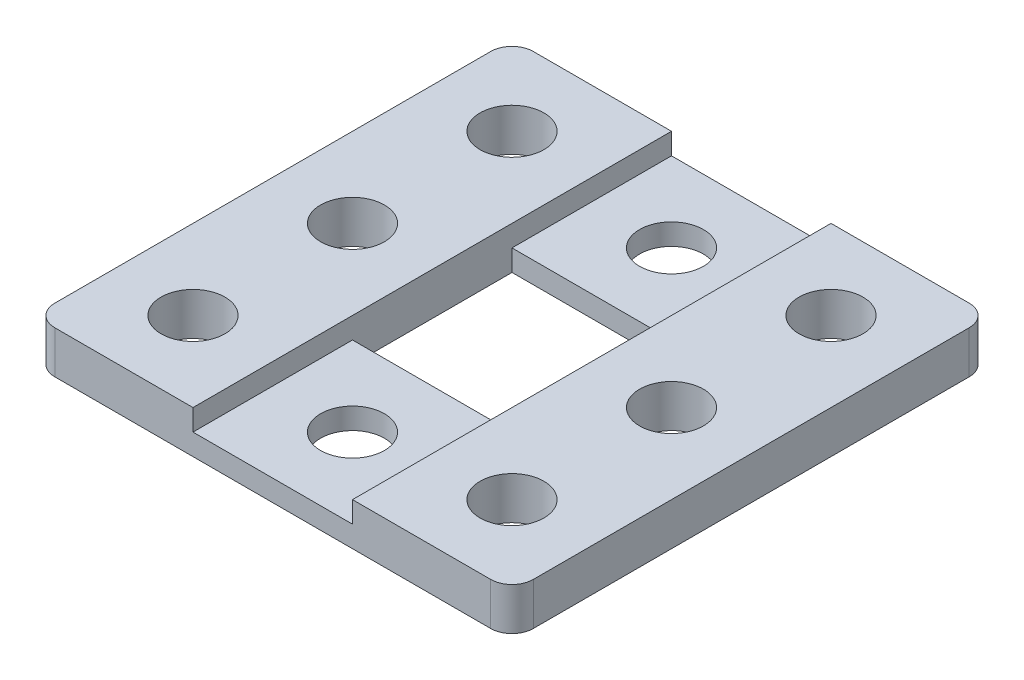
ISO-10303-21;
HEADER;
FILE_DESCRIPTION(('STEP AP214'),'2;1');
FILE_NAME('part.step','',(''),(''),'','','');
FILE_SCHEMA(('AUTOMOTIVE_DESIGN { 1 0 10303 214 1 1 1 1 }'));
ENDSEC;
DATA;
#1=APPLICATION_CONTEXT('core data for automotive mechanical design processes');
#2=APPLICATION_PROTOCOL_DEFINITION('international standard','automotive_design',2000,#1);
#3=PRODUCT_CONTEXT('',#1,'mechanical');
#4=PRODUCT('Part','Part','',(#3));
#5=PRODUCT_RELATED_PRODUCT_CATEGORY('part','',(#4));
#6=PRODUCT_DEFINITION_FORMATION('','',#4);
#7=PRODUCT_DEFINITION_CONTEXT('part definition',#1,'design');
#8=PRODUCT_DEFINITION('design','',#6,#7);
#9=PRODUCT_DEFINITION_SHAPE('','',#8);
#10=(LENGTH_UNIT() NAMED_UNIT(*) SI_UNIT(.MILLI.,.METRE.));
#11=(NAMED_UNIT(*) PLANE_ANGLE_UNIT() SI_UNIT($,.RADIAN.));
#12=(NAMED_UNIT(*) SI_UNIT($,.STERADIAN.) SOLID_ANGLE_UNIT());
#13=UNCERTAINTY_MEASURE_WITH_UNIT(LENGTH_MEASURE(1.E-05),#10,'distance_accuracy_value','');
#14=(GEOMETRIC_REPRESENTATION_CONTEXT(3) GLOBAL_UNCERTAINTY_ASSIGNED_CONTEXT((#13)) GLOBAL_UNIT_ASSIGNED_CONTEXT((#10,
#11,#12)) REPRESENTATION_CONTEXT('',''));
#15=CARTESIAN_POINT('',(0.,0.,0.));
#16=DIRECTION('',(0.,0.,1.));
#17=DIRECTION('',(1.,0.,0.));
#18=AXIS2_PLACEMENT_3D('',#15,#16,#17);
#19=CARTESIAN_POINT('',(0.,1.,0.));
#20=DIRECTION('',(0.,1.,0.));
#21=DIRECTION('',(0.,0.,1.));
#22=AXIS2_PLACEMENT_3D('',#19,#20,#21);
#23=PLANE('',#22);
#24=DIRECTION('',(-1.,0.,0.));
#25=VECTOR('',#24,1.);
#26=CARTESIAN_POINT('',(-3.75,1.,-3.75));
#27=LINE('',#26,#25);
#28=CARTESIAN_POINT('',(3.75,1.,-3.75));
#29=VERTEX_POINT('',#28);
#30=CARTESIAN_POINT('',(-3.75,1.,-3.75));
#31=VERTEX_POINT('',#30);
#32=EDGE_CURVE('E166',#29,#31,#27,.T.);
#33=ORIENTED_EDGE('',*,*,#32,.F.);
#34=DIRECTION('',(0.,0.,-1.));
#35=VECTOR('',#34,1.);
#36=CARTESIAN_POINT('',(3.75,1.,-11.25));
#37=LINE('',#36,#35);
#38=CARTESIAN_POINT('',(3.75,1.,-11.25));
#39=VERTEX_POINT('',#38);
#40=EDGE_CURVE('E175',#29,#39,#37,.T.);
#41=ORIENTED_EDGE('',*,*,#40,.T.);
#42=DIRECTION('',(-1.,0.,0.));
#43=VECTOR('',#42,1.);
#44=CARTESIAN_POINT('',(-3.75,1.,-11.25));
#45=LINE('',#44,#43);
#46=CARTESIAN_POINT('',(-3.75,1.,-11.25));
#47=VERTEX_POINT('',#46);
#48=EDGE_CURVE('E174',#39,#47,#45,.T.);
#49=ORIENTED_EDGE('',*,*,#48,.T.);
#50=DIRECTION('',(0.,0.,1.));
#51=VECTOR('',#50,1.);
#52=CARTESIAN_POINT('',(-3.75,1.,-11.25));
#53=LINE('',#52,#51);
#54=EDGE_CURVE('E298',#47,#31,#53,.T.);
#55=ORIENTED_EDGE('',*,*,#54,.T.);
#56=EDGE_LOOP('',(#33,#41,#49,#55));
#57=FACE_BOUND('',#56,.T.);
#58=CARTESIAN_POINT('',(0.,1.,-7.5));
#59=DIRECTION('',(0.,1.,0.));
#60=DIRECTION('',(0.,0.,1.));
#61=AXIS2_PLACEMENT_3D('',#58,#59,#60);
#62=CIRCLE('',#61,1.5);
#63=CARTESIAN_POINT('',(0.,1.,-6.));
#64=VERTEX_POINT('',#63);
#65=EDGE_CURVE('E308',#64,#64,#62,.T.);
#66=ORIENTED_EDGE('',*,*,#65,.F.);
#67=EDGE_LOOP('',(#66));
#68=FACE_BOUND('',#67,.T.);
#69=ADVANCED_FACE('F33',(#57,#68),#23,.T.);
#70=CARTESIAN_POINT('',(0.,2.,0.));
#71=DIRECTION('',(0.,1.,0.));
#72=DIRECTION('',(0.,0.,1.));
#73=AXIS2_PLACEMENT_3D('',#70,#71,#72);
#74=PLANE('',#73);
#75=CARTESIAN_POINT('',(-7.5,2.,-7.5));
#76=DIRECTION('',(0.,1.,0.));
#77=DIRECTION('',(0.,0.,1.));
#78=AXIS2_PLACEMENT_3D('',#75,#76,#77);
#79=CIRCLE('',#78,1.5);
#80=CARTESIAN_POINT('',(-7.5,2.,-6.));
#81=VERTEX_POINT('',#80);
#82=EDGE_CURVE('E342',#81,#81,#79,.T.);
#83=ORIENTED_EDGE('',*,*,#82,.F.);
#84=EDGE_LOOP('',(#83));
#85=FACE_BOUND('',#84,.T.);
#86=CARTESIAN_POINT('',(-7.5,2.,7.5));
#87=DIRECTION('',(0.,1.,0.));
#88=DIRECTION('',(0.,0.,1.));
#89=AXIS2_PLACEMENT_3D('',#86,#87,#88);
#90=CIRCLE('',#89,1.5);
#91=CARTESIAN_POINT('',(-7.5,2.,9.));
#92=VERTEX_POINT('',#91);
#93=EDGE_CURVE('E336',#92,#92,#90,.T.);
#94=ORIENTED_EDGE('',*,*,#93,.F.);
#95=EDGE_LOOP('',(#94));
#96=FACE_BOUND('',#95,.T.);
#97=CARTESIAN_POINT('',(-7.5,2.,0.));
#98=DIRECTION('',(0.,1.,0.));
#99=DIRECTION('',(0.,0.,1.));
#100=AXIS2_PLACEMENT_3D('',#97,#98,#99);
#101=CIRCLE('',#100,1.5);
#102=CARTESIAN_POINT('',(-7.5,2.,1.5));
#103=VERTEX_POINT('',#102);
#104=EDGE_CURVE('E329',#103,#103,#101,.T.);
#105=ORIENTED_EDGE('',*,*,#104,.F.);
#106=EDGE_LOOP('',(#105));
#107=FACE_BOUND('',#106,.T.);
#108=DIRECTION('',(-1.,0.,0.));
#109=VECTOR('',#108,1.);
#110=CARTESIAN_POINT('',(-11.25,2.,-11.25));
#111=LINE('',#110,#109);
#112=CARTESIAN_POINT('',(-3.75,2.,-11.25));
#113=VERTEX_POINT('',#112);
#114=CARTESIAN_POINT('',(-10.25,2.,-11.25));
#115=VERTEX_POINT('',#114);
#116=EDGE_CURVE('E202',#113,#115,#111,.T.);
#117=ORIENTED_EDGE('',*,*,#116,.T.);
#118=CARTESIAN_POINT('',(-10.25,2.,-10.25));
#119=DIRECTION('',(0.,1.,0.));
#120=DIRECTION('',(0.,0.,1.));
#121=AXIS2_PLACEMENT_3D('',#118,#119,#120);
#122=CIRCLE('',#121,1.);
#123=CARTESIAN_POINT('',(-11.25,2.,-10.25));
#124=VERTEX_POINT('',#123);
#125=EDGE_CURVE('E241',#115,#124,#122,.T.);
#126=ORIENTED_EDGE('',*,*,#125,.T.);
#127=DIRECTION('',(0.,0.,1.));
#128=VECTOR('',#127,1.);
#129=CARTESIAN_POINT('',(-11.25,2.,-11.25));
#130=LINE('',#129,#128);
#131=CARTESIAN_POINT('',(-11.25,2.,10.25));
#132=VERTEX_POINT('',#131);
#133=EDGE_CURVE('E206',#124,#132,#130,.T.);
#134=ORIENTED_EDGE('',*,*,#133,.T.);
#135=CARTESIAN_POINT('',(-10.25,2.,10.25));
#136=DIRECTION('',(0.,1.,0.));
#137=DIRECTION('',(0.,0.,1.));
#138=AXIS2_PLACEMENT_3D('',#135,#136,#137);
#139=CIRCLE('',#138,1.);
#140=CARTESIAN_POINT('',(-10.25,2.,11.25));
#141=VERTEX_POINT('',#140);
#142=EDGE_CURVE('E239',#132,#141,#139,.T.);
#143=ORIENTED_EDGE('',*,*,#142,.T.);
#144=DIRECTION('',(1.,0.,0.));
#145=VECTOR('',#144,1.);
#146=CARTESIAN_POINT('',(-11.25,2.,11.25));
#147=LINE('',#146,#145);
#148=CARTESIAN_POINT('',(-3.75,2.,11.25));
#149=VERTEX_POINT('',#148);
#150=EDGE_CURVE('E210',#141,#149,#147,.T.);
#151=ORIENTED_EDGE('',*,*,#150,.T.);
#152=DIRECTION('',(0.,0.,1.));
#153=VECTOR('',#152,1.);
#154=CARTESIAN_POINT('',(-3.75,2.,-11.25));
#155=LINE('',#154,#153);
#156=EDGE_CURVE('E183',#113,#149,#155,.T.);
#157=ORIENTED_EDGE('',*,*,#156,.F.);
#158=EDGE_LOOP('',(#117,#126,#134,#143,#151,#157));
#159=FACE_BOUND('',#158,.T.);
#160=ADVANCED_FACE('F294',(#85,#96,#107,#159),#74,.T.);
#161=CARTESIAN_POINT('',(11.25,2.,-11.25));
#162=DIRECTION('',(-1.,0.,0.));
#163=DIRECTION('',(0.,0.,1.));
#164=AXIS2_PLACEMENT_3D('',#161,#162,#163);
#165=PLANE('',#164);
#166=DIRECTION('',(0.,0.,-1.));
#167=VECTOR('',#166,1.);
#168=CARTESIAN_POINT('',(11.25,2.,-11.25));
#169=LINE('',#168,#167);
#170=CARTESIAN_POINT('',(11.25,2.,10.25));
#171=VERTEX_POINT('',#170);
#172=CARTESIAN_POINT('',(11.25,2.,-10.25));
#173=VERTEX_POINT('',#172);
#174=EDGE_CURVE('E200',#171,#173,#169,.T.);
#175=ORIENTED_EDGE('',*,*,#174,.F.);
#176=DIRECTION('',(0.,-1.,0.));
#177=VECTOR('',#176,1.);
#178=CARTESIAN_POINT('',(11.25,2.,10.25));
#179=LINE('',#178,#177);
#180=CARTESIAN_POINT('',(11.25,0.,10.25));
#181=VERTEX_POINT('',#180);
#182=EDGE_CURVE('E249',#171,#181,#179,.T.);
#183=ORIENTED_EDGE('',*,*,#182,.T.);
#184=DIRECTION('',(0.,0.,-1.));
#185=VECTOR('',#184,1.);
#186=CARTESIAN_POINT('',(11.25,0.,-11.25));
#187=LINE('',#186,#185);
#188=CARTESIAN_POINT('',(11.25,0.,-10.25));
#189=VERTEX_POINT('',#188);
#190=EDGE_CURVE('E192',#181,#189,#187,.T.);
#191=ORIENTED_EDGE('',*,*,#190,.T.);
#192=DIRECTION('',(0.,-1.,0.));
#193=VECTOR('',#192,1.);
#194=CARTESIAN_POINT('',(11.25,2.,-10.25));
#195=LINE('',#194,#193);
#196=EDGE_CURVE('E48',#189,#173,#195,.F.);
#197=ORIENTED_EDGE('',*,*,#196,.T.);
#198=EDGE_LOOP('',(#175,#183,#191,#197));
#199=FACE_BOUND('',#198,.T.);
#200=ADVANCED_FACE('F266',(#199),#165,.F.);
#201=CARTESIAN_POINT('',(-11.25,2.,-11.25));
#202=DIRECTION('',(0.,0.,1.));
#203=DIRECTION('',(1.,0.,0.));
#204=AXIS2_PLACEMENT_3D('',#201,#202,#203);
#205=PLANE('',#204);
#206=DIRECTION('',(-1.,0.,0.));
#207=VECTOR('',#206,1.);
#208=CARTESIAN_POINT('',(-11.25,0.,-11.25));
#209=LINE('',#208,#207);
#210=CARTESIAN_POINT('',(10.25,0.,-11.25));
#211=VERTEX_POINT('',#210);
#212=CARTESIAN_POINT('',(-10.25,0.,-11.25));
#213=VERTEX_POINT('',#212);
#214=EDGE_CURVE('E214',#211,#213,#209,.T.);
#215=ORIENTED_EDGE('',*,*,#214,.T.);
#216=DIRECTION('',(0.,-1.,0.));
#217=VECTOR('',#216,1.);
#218=CARTESIAN_POINT('',(-10.25,2.,-11.25));
#219=LINE('',#218,#217);
#220=EDGE_CURVE('E237',#213,#115,#219,.F.);
#221=ORIENTED_EDGE('',*,*,#220,.T.);
#222=ORIENTED_EDGE('',*,*,#116,.F.);
#223=DIRECTION('',(0.,1.,0.));
#224=VECTOR('',#223,1.);
#225=CARTESIAN_POINT('',(-3.75,1.,-11.25));
#226=LINE('',#225,#224);
#227=EDGE_CURVE('E190',#47,#113,#226,.T.);
#228=ORIENTED_EDGE('',*,*,#227,.F.);
#229=ORIENTED_EDGE('',*,*,#48,.F.);
#230=DIRECTION('',(0.,1.,0.));
#231=VECTOR('',#230,1.);
#232=CARTESIAN_POINT('',(3.75,1.,-11.25));
#233=LINE('',#232,#231);
#234=CARTESIAN_POINT('',(3.75,2.,-11.25));
#235=VERTEX_POINT('',#234);
#236=EDGE_CURVE('E193',#39,#235,#233,.T.);
#237=ORIENTED_EDGE('',*,*,#236,.T.);
#238=CARTESIAN_POINT('',(10.25,2.,-11.25));
#239=VERTEX_POINT('',#238);
#240=EDGE_CURVE('E204',#239,#235,#111,.T.);
#241=ORIENTED_EDGE('',*,*,#240,.F.);
#242=DIRECTION('',(0.,-1.,0.));
#243=VECTOR('',#242,1.);
#244=CARTESIAN_POINT('',(10.25,2.,-11.25));
#245=LINE('',#244,#243);
#246=EDGE_CURVE('E234',#239,#211,#245,.T.);
#247=ORIENTED_EDGE('',*,*,#246,.T.);
#248=EDGE_LOOP('',(#215,#221,#222,#228,#229,#237,#241,#247));
#249=FACE_BOUND('',#248,.T.);
#250=ADVANCED_FACE('F258',(#249),#205,.F.);
#251=CARTESIAN_POINT('',(-11.25,2.,-11.25));
#252=DIRECTION('',(1.,0.,0.));
#253=DIRECTION('',(0.,0.,-1.));
#254=AXIS2_PLACEMENT_3D('',#251,#252,#253);
#255=PLANE('',#254);
#256=ORIENTED_EDGE('',*,*,#133,.F.);
#257=DIRECTION('',(0.,-1.,0.));
#258=VECTOR('',#257,1.);
#259=CARTESIAN_POINT('',(-11.25,2.,-10.25));
#260=LINE('',#259,#258);
#261=CARTESIAN_POINT('',(-11.25,0.,-10.25));
#262=VERTEX_POINT('',#261);
#263=EDGE_CURVE('E223',#124,#262,#260,.T.);
#264=ORIENTED_EDGE('',*,*,#263,.T.);
#265=DIRECTION('',(0.,0.,1.));
#266=VECTOR('',#265,1.);
#267=CARTESIAN_POINT('',(-11.25,0.,-11.25));
#268=LINE('',#267,#266);
#269=CARTESIAN_POINT('',(-11.25,0.,10.25));
#270=VERTEX_POINT('',#269);
#271=EDGE_CURVE('E217',#262,#270,#268,.T.);
#272=ORIENTED_EDGE('',*,*,#271,.T.);
#273=DIRECTION('',(0.,-1.,0.));
#274=VECTOR('',#273,1.);
#275=CARTESIAN_POINT('',(-11.25,2.,10.25));
#276=LINE('',#275,#274);
#277=EDGE_CURVE('E212',#270,#132,#276,.F.);
#278=ORIENTED_EDGE('',*,*,#277,.T.);
#279=EDGE_LOOP('',(#256,#264,#272,#278));
#280=FACE_BOUND('',#279,.T.);
#281=ADVANCED_FACE('F283',(#280),#255,.F.);
#282=CARTESIAN_POINT('',(-11.25,2.,11.25));
#283=DIRECTION('',(0.,0.,-1.));
#284=DIRECTION('',(-1.,0.,0.));
#285=AXIS2_PLACEMENT_3D('',#282,#283,#284);
#286=PLANE('',#285);
#287=ORIENTED_EDGE('',*,*,#150,.F.);
#288=DIRECTION('',(0.,-1.,0.));
#289=VECTOR('',#288,1.);
#290=CARTESIAN_POINT('',(-10.25,2.,11.25));
#291=LINE('',#290,#289);
#292=CARTESIAN_POINT('',(-10.25,0.,11.25));
#293=VERTEX_POINT('',#292);
#294=EDGE_CURVE('E245',#141,#293,#291,.T.);
#295=ORIENTED_EDGE('',*,*,#294,.T.);
#296=DIRECTION('',(1.,0.,0.));
#297=VECTOR('',#296,1.);
#298=CARTESIAN_POINT('',(-11.25,0.,11.25));
#299=LINE('',#298,#297);
#300=CARTESIAN_POINT('',(10.25,0.,11.25));
#301=VERTEX_POINT('',#300);
#302=EDGE_CURVE('E203',#293,#301,#299,.T.);
#303=ORIENTED_EDGE('',*,*,#302,.T.);
#304=DIRECTION('',(0.,-1.,0.));
#305=VECTOR('',#304,1.);
#306=CARTESIAN_POINT('',(10.25,2.,11.25));
#307=LINE('',#306,#305);
#308=CARTESIAN_POINT('',(10.25,2.,11.25));
#309=VERTEX_POINT('',#308);
#310=EDGE_CURVE('E243',#301,#309,#307,.F.);
#311=ORIENTED_EDGE('',*,*,#310,.T.);
#312=CARTESIAN_POINT('',(3.75,2.,11.25));
#313=VERTEX_POINT('',#312);
#314=EDGE_CURVE('E209',#313,#309,#147,.T.);
#315=ORIENTED_EDGE('',*,*,#314,.F.);
#316=DIRECTION('',(0.,1.,0.));
#317=VECTOR('',#316,1.);
#318=CARTESIAN_POINT('',(3.75,1.,11.25));
#319=LINE('',#318,#317);
#320=CARTESIAN_POINT('',(3.75,1.,11.25));
#321=VERTEX_POINT('',#320);
#322=EDGE_CURVE('E196',#321,#313,#319,.T.);
#323=ORIENTED_EDGE('',*,*,#322,.F.);
#324=DIRECTION('',(1.,0.,0.));
#325=VECTOR('',#324,1.);
#326=CARTESIAN_POINT('',(-3.75,1.,11.25));
#327=LINE('',#326,#325);
#328=CARTESIAN_POINT('',(-3.75,1.,11.25));
#329=VERTEX_POINT('',#328);
#330=EDGE_CURVE('E172',#329,#321,#327,.T.);
#331=ORIENTED_EDGE('',*,*,#330,.F.);
#332=DIRECTION('',(0.,1.,0.));
#333=VECTOR('',#332,1.);
#334=CARTESIAN_POINT('',(-3.75,1.,11.25));
#335=LINE('',#334,#333);
#336=EDGE_CURVE('E178',#329,#149,#335,.T.);
#337=ORIENTED_EDGE('',*,*,#336,.T.);
#338=EDGE_LOOP('',(#287,#295,#303,#311,#315,#323,#331,#337));
#339=FACE_BOUND('',#338,.T.);
#340=ADVANCED_FACE('F274',(#339),#286,.F.);
#341=CARTESIAN_POINT('',(7.5,2.,7.5));
#342=DIRECTION('',(0.,1.,0.));
#343=DIRECTION('',(0.,0.,1.));
#344=AXIS2_PLACEMENT_3D('',#341,#342,#343);
#345=CIRCLE('',#344,1.5);
#346=CARTESIAN_POINT('',(7.5,2.,9.));
#347=VERTEX_POINT('',#346);
#348=EDGE_CURVE('E353',#347,#347,#345,.T.);
#349=ORIENTED_EDGE('',*,*,#348,.F.);
#350=EDGE_LOOP('',(#349));
#351=FACE_BOUND('',#350,.T.);
#352=CARTESIAN_POINT('',(7.5,2.,-7.5));
#353=DIRECTION('',(0.,1.,0.));
#354=DIRECTION('',(0.,0.,1.));
#355=AXIS2_PLACEMENT_3D('',#352,#353,#354);
#356=CIRCLE('',#355,1.5);
#357=CARTESIAN_POINT('',(7.5,2.,-6.));
#358=VERTEX_POINT('',#357);
#359=EDGE_CURVE('E359',#358,#358,#356,.T.);
#360=ORIENTED_EDGE('',*,*,#359,.F.);
#361=EDGE_LOOP('',(#360));
#362=FACE_BOUND('',#361,.T.);
#363=CARTESIAN_POINT('',(7.5,2.,0.));
#364=DIRECTION('',(0.,1.,0.));
#365=DIRECTION('',(0.,0.,1.));
#366=AXIS2_PLACEMENT_3D('',#363,#364,#365);
#367=CIRCLE('',#366,1.5);
#368=CARTESIAN_POINT('',(7.5,2.,1.5));
#369=VERTEX_POINT('',#368);
#370=EDGE_CURVE('E347',#369,#369,#367,.T.);
#371=ORIENTED_EDGE('',*,*,#370,.F.);
#372=EDGE_LOOP('',(#371));
#373=FACE_BOUND('',#372,.T.);
#374=ORIENTED_EDGE('',*,*,#314,.T.);
#375=CARTESIAN_POINT('',(10.25,2.,10.25));
#376=DIRECTION('',(0.,1.,0.));
#377=DIRECTION('',(0.,0.,1.));
#378=AXIS2_PLACEMENT_3D('',#375,#376,#377);
#379=CIRCLE('',#378,1.);
#380=EDGE_CURVE('E11',#309,#171,#379,.T.);
#381=ORIENTED_EDGE('',*,*,#380,.T.);
#382=ORIENTED_EDGE('',*,*,#174,.T.);
#383=CARTESIAN_POINT('',(10.25,2.,-10.25));
#384=DIRECTION('',(0.,1.,0.));
#385=DIRECTION('',(0.,0.,1.));
#386=AXIS2_PLACEMENT_3D('',#383,#384,#385);
#387=CIRCLE('',#386,1.);
#388=EDGE_CURVE('E41',#173,#239,#387,.T.);
#389=ORIENTED_EDGE('',*,*,#388,.T.);
#390=ORIENTED_EDGE('',*,*,#240,.T.);
#391=DIRECTION('',(0.,0.,-1.));
#392=VECTOR('',#391,1.);
#393=CARTESIAN_POINT('',(3.75,2.,-11.25));
#394=LINE('',#393,#392);
#395=EDGE_CURVE('E186',#313,#235,#394,.T.);
#396=ORIENTED_EDGE('',*,*,#395,.F.);
#397=EDGE_LOOP('',(#374,#381,#382,#389,#390,#396));
#398=FACE_BOUND('',#397,.T.);
#399=ADVANCED_FACE('F253',(#351,#362,#373,#398),#74,.T.);
#400=CARTESIAN_POINT('',(0.,0.,0.));
#401=DIRECTION('',(0.,1.,0.));
#402=DIRECTION('',(0.,0.,1.));
#403=AXIS2_PLACEMENT_3D('',#400,#401,#402);
#404=PLANE('',#403);
#405=CARTESIAN_POINT('',(7.5,0.,7.5));
#406=DIRECTION('',(0.,1.,0.));
#407=DIRECTION('',(0.,0.,1.));
#408=AXIS2_PLACEMENT_3D('',#405,#406,#407);
#409=CIRCLE('',#408,1.5);
#410=CARTESIAN_POINT('',(7.5,0.,9.));
#411=VERTEX_POINT('',#410);
#412=EDGE_CURVE('E356',#411,#411,#409,.T.);
#413=ORIENTED_EDGE('',*,*,#412,.T.);
#414=EDGE_LOOP('',(#413));
#415=FACE_BOUND('',#414,.T.);
#416=CARTESIAN_POINT('',(7.5,0.,-7.5));
#417=DIRECTION('',(0.,1.,0.));
#418=DIRECTION('',(0.,0.,1.));
#419=AXIS2_PLACEMENT_3D('',#416,#417,#418);
#420=CIRCLE('',#419,1.5);
#421=CARTESIAN_POINT('',(7.5,0.,-6.));
#422=VERTEX_POINT('',#421);
#423=EDGE_CURVE('E350',#422,#422,#420,.T.);
#424=ORIENTED_EDGE('',*,*,#423,.T.);
#425=EDGE_LOOP('',(#424));
#426=FACE_BOUND('',#425,.T.);
#427=CARTESIAN_POINT('',(7.5,0.,0.));
#428=DIRECTION('',(0.,1.,0.));
#429=DIRECTION('',(0.,0.,1.));
#430=AXIS2_PLACEMENT_3D('',#427,#428,#429);
#431=CIRCLE('',#430,1.5);
#432=CARTESIAN_POINT('',(7.5,0.,1.5));
#433=VERTEX_POINT('',#432);
#434=EDGE_CURVE('E333',#433,#433,#431,.T.);
#435=ORIENTED_EDGE('',*,*,#434,.T.);
#436=EDGE_LOOP('',(#435));
#437=FACE_BOUND('',#436,.T.);
#438=CARTESIAN_POINT('',(-7.5,0.,-7.5));
#439=DIRECTION('',(0.,1.,0.));
#440=DIRECTION('',(0.,0.,1.));
#441=AXIS2_PLACEMENT_3D('',#438,#439,#440);
#442=CIRCLE('',#441,1.5);
#443=CARTESIAN_POINT('',(-7.5,0.,-6.));
#444=VERTEX_POINT('',#443);
#445=EDGE_CURVE('E167',#444,#444,#442,.T.);
#446=ORIENTED_EDGE('',*,*,#445,.T.);
#447=EDGE_LOOP('',(#446));
#448=FACE_BOUND('',#447,.T.);
#449=CARTESIAN_POINT('',(-7.5,0.,7.5));
#450=DIRECTION('',(0.,1.,0.));
#451=DIRECTION('',(0.,0.,1.));
#452=AXIS2_PLACEMENT_3D('',#449,#450,#451);
#453=CIRCLE('',#452,1.5);
#454=CARTESIAN_POINT('',(-7.5,0.,9.));
#455=VERTEX_POINT('',#454);
#456=EDGE_CURVE('E339',#455,#455,#453,.T.);
#457=ORIENTED_EDGE('',*,*,#456,.T.);
#458=EDGE_LOOP('',(#457));
#459=FACE_BOUND('',#458,.T.);
#460=CARTESIAN_POINT('',(-7.5,0.,0.));
#461=DIRECTION('',(0.,1.,0.));
#462=DIRECTION('',(0.,0.,1.));
#463=AXIS2_PLACEMENT_3D('',#460,#461,#462);
#464=CIRCLE('',#463,1.5);
#465=CARTESIAN_POINT('',(-7.5,0.,1.5));
#466=VERTEX_POINT('',#465);
#467=EDGE_CURVE('E332',#466,#466,#464,.T.);
#468=ORIENTED_EDGE('',*,*,#467,.T.);
#469=EDGE_LOOP('',(#468));
#470=FACE_BOUND('',#469,.T.);
#471=DIRECTION('',(-1.,0.,0.));
#472=VECTOR('',#471,1.);
#473=CARTESIAN_POINT('',(0.,0.,-3.75));
#474=LINE('',#473,#472);
#475=CARTESIAN_POINT('',(3.75,0.,-3.75));
#476=VERTEX_POINT('',#475);
#477=CARTESIAN_POINT('',(-3.75,0.,-3.75));
#478=VERTEX_POINT('',#477);
#479=EDGE_CURVE('E317',#476,#478,#474,.T.);
#480=ORIENTED_EDGE('',*,*,#479,.T.);
#481=DIRECTION('',(0.,0.,1.));
#482=VECTOR('',#481,1.);
#483=CARTESIAN_POINT('',(-3.75,0.,0.));
#484=LINE('',#483,#482);
#485=CARTESIAN_POINT('',(-3.75,0.,3.75));
#486=VERTEX_POINT('',#485);
#487=EDGE_CURVE('E312',#478,#486,#484,.T.);
#488=ORIENTED_EDGE('',*,*,#487,.T.);
#489=DIRECTION('',(1.,0.,0.));
#490=VECTOR('',#489,1.);
#491=CARTESIAN_POINT('',(0.,0.,3.75));
#492=LINE('',#491,#490);
#493=CARTESIAN_POINT('',(3.75,0.,3.75));
#494=VERTEX_POINT('',#493);
#495=EDGE_CURVE('E321',#486,#494,#492,.T.);
#496=ORIENTED_EDGE('',*,*,#495,.T.);
#497=DIRECTION('',(0.,0.,-1.));
#498=VECTOR('',#497,1.);
#499=CARTESIAN_POINT('',(3.75,0.,0.));
#500=LINE('',#499,#498);
#501=EDGE_CURVE('E154',#494,#476,#500,.T.);
#502=ORIENTED_EDGE('',*,*,#501,.T.);
#503=EDGE_LOOP('',(#480,#488,#496,#502));
#504=FACE_BOUND('',#503,.T.);
#505=CARTESIAN_POINT('',(0.,0.,-7.5));
#506=DIRECTION('',(0.,1.,0.));
#507=DIRECTION('',(0.,0.,1.));
#508=AXIS2_PLACEMENT_3D('',#505,#506,#507);
#509=CIRCLE('',#508,1.5);
#510=CARTESIAN_POINT('',(0.,0.,-6.));
#511=VERTEX_POINT('',#510);
#512=EDGE_CURVE('E187',#511,#511,#509,.T.);
#513=ORIENTED_EDGE('',*,*,#512,.T.);
#514=EDGE_LOOP('',(#513));
#515=FACE_BOUND('',#514,.T.);
#516=CARTESIAN_POINT('',(0.,0.,7.5));
#517=DIRECTION('',(0.,1.,0.));
#518=DIRECTION('',(0.,0.,1.));
#519=AXIS2_PLACEMENT_3D('',#516,#517,#518);
#520=CIRCLE('',#519,1.5);
#521=CARTESIAN_POINT('',(0.,0.,9.));
#522=VERTEX_POINT('',#521);
#523=EDGE_CURVE('E305',#522,#522,#520,.T.);
#524=ORIENTED_EDGE('',*,*,#523,.T.);
#525=EDGE_LOOP('',(#524));
#526=FACE_BOUND('',#525,.T.);
#527=ORIENTED_EDGE('',*,*,#271,.F.);
#528=CARTESIAN_POINT('',(-10.25,0.,-10.25));
#529=DIRECTION('',(0.,1.,0.));
#530=DIRECTION('',(0.,0.,1.));
#531=AXIS2_PLACEMENT_3D('',#528,#529,#530);
#532=CIRCLE('',#531,1.);
#533=EDGE_CURVE('E232',#262,#213,#532,.F.);
#534=ORIENTED_EDGE('',*,*,#533,.T.);
#535=ORIENTED_EDGE('',*,*,#214,.F.);
#536=CARTESIAN_POINT('',(10.25,0.,-10.25));
#537=DIRECTION('',(0.,1.,0.));
#538=DIRECTION('',(0.,0.,1.));
#539=AXIS2_PLACEMENT_3D('',#536,#537,#538);
#540=CIRCLE('',#539,1.);
#541=EDGE_CURVE('E226',#211,#189,#540,.F.);
#542=ORIENTED_EDGE('',*,*,#541,.T.);
#543=ORIENTED_EDGE('',*,*,#190,.F.);
#544=CARTESIAN_POINT('',(10.25,0.,10.25));
#545=DIRECTION('',(0.,1.,0.));
#546=DIRECTION('',(0.,0.,1.));
#547=AXIS2_PLACEMENT_3D('',#544,#545,#546);
#548=CIRCLE('',#547,1.);
#549=EDGE_CURVE('E228',#181,#301,#548,.F.);
#550=ORIENTED_EDGE('',*,*,#549,.T.);
#551=ORIENTED_EDGE('',*,*,#302,.F.);
#552=CARTESIAN_POINT('',(-10.25,0.,10.25));
#553=DIRECTION('',(0.,1.,0.));
#554=DIRECTION('',(0.,0.,1.));
#555=AXIS2_PLACEMENT_3D('',#552,#553,#554);
#556=CIRCLE('',#555,1.);
#557=EDGE_CURVE('E230',#293,#270,#556,.F.);
#558=ORIENTED_EDGE('',*,*,#557,.T.);
#559=EDGE_LOOP('',(#527,#534,#535,#542,#543,#550,#551,#558));
#560=FACE_BOUND('',#559,.T.);
#561=ADVANCED_FACE('F265',(#415,#426,#437,#448,#459,#470,#504,#515,#526,#560),#404,.F.);
#562=CARTESIAN_POINT('',(-3.75,1.,-11.25));
#563=DIRECTION('',(-1.,0.,0.));
#564=DIRECTION('',(0.,0.,1.));
#565=AXIS2_PLACEMENT_3D('',#562,#563,#564);
#566=PLANE('',#565);
#567=ORIENTED_EDGE('',*,*,#156,.T.);
#568=ORIENTED_EDGE('',*,*,#336,.F.);
#569=CARTESIAN_POINT('',(-3.75,1.,3.75));
#570=VERTEX_POINT('',#569);
#571=EDGE_CURVE('E189',#570,#329,#53,.T.);
#572=ORIENTED_EDGE('',*,*,#571,.F.);
#573=DIRECTION('',(0.,1.,0.));
#574=VECTOR('',#573,1.);
#575=CARTESIAN_POINT('',(-3.75,-1.,3.75));
#576=LINE('',#575,#574);
#577=EDGE_CURVE('E158',#486,#570,#576,.T.);
#578=ORIENTED_EDGE('',*,*,#577,.F.);
#579=ORIENTED_EDGE('',*,*,#487,.F.);
#580=DIRECTION('',(0.,1.,0.));
#581=VECTOR('',#580,1.);
#582=CARTESIAN_POINT('',(-3.75,-1.,-3.75));
#583=LINE('',#582,#581);
#584=EDGE_CURVE('E323',#478,#31,#583,.T.);
#585=ORIENTED_EDGE('',*,*,#584,.T.);
#586=ORIENTED_EDGE('',*,*,#54,.F.);
#587=ORIENTED_EDGE('',*,*,#227,.T.);
#588=EDGE_LOOP('',(#567,#568,#572,#578,#579,#585,#586,#587));
#589=FACE_BOUND('',#588,.T.);
#590=ADVANCED_FACE('F297',(#589),#566,.F.);
#591=CARTESIAN_POINT('',(3.75,1.,-11.25));
#592=DIRECTION('',(1.,0.,0.));
#593=DIRECTION('',(0.,0.,-1.));
#594=AXIS2_PLACEMENT_3D('',#591,#592,#593);
#595=PLANE('',#594);
#596=ORIENTED_EDGE('',*,*,#395,.T.);
#597=ORIENTED_EDGE('',*,*,#236,.F.);
#598=ORIENTED_EDGE('',*,*,#40,.F.);
#599=DIRECTION('',(0.,1.,0.));
#600=VECTOR('',#599,1.);
#601=CARTESIAN_POINT('',(3.75,-1.,-3.75));
#602=LINE('',#601,#600);
#603=EDGE_CURVE('E157',#476,#29,#602,.T.);
#604=ORIENTED_EDGE('',*,*,#603,.F.);
#605=ORIENTED_EDGE('',*,*,#501,.F.);
#606=DIRECTION('',(0.,1.,0.));
#607=VECTOR('',#606,1.);
#608=CARTESIAN_POINT('',(3.75,-1.,3.75));
#609=LINE('',#608,#607);
#610=CARTESIAN_POINT('',(3.75,1.,3.75));
#611=VERTEX_POINT('',#610);
#612=EDGE_CURVE('E145',#494,#611,#609,.T.);
#613=ORIENTED_EDGE('',*,*,#612,.T.);
#614=EDGE_CURVE('E150',#321,#611,#37,.T.);
#615=ORIENTED_EDGE('',*,*,#614,.F.);
#616=ORIENTED_EDGE('',*,*,#322,.T.);
#617=EDGE_LOOP('',(#596,#597,#598,#604,#605,#613,#615,#616));
#618=FACE_BOUND('',#617,.T.);
#619=ADVANCED_FACE('F148',(#618),#595,.F.);
#620=DIRECTION('',(1.,0.,0.));
#621=VECTOR('',#620,1.);
#622=CARTESIAN_POINT('',(-3.75,1.,3.75));
#623=LINE('',#622,#621);
#624=EDGE_CURVE('E161',#570,#611,#623,.T.);
#625=ORIENTED_EDGE('',*,*,#624,.F.);
#626=ORIENTED_EDGE('',*,*,#571,.T.);
#627=ORIENTED_EDGE('',*,*,#330,.T.);
#628=ORIENTED_EDGE('',*,*,#614,.T.);
#629=EDGE_LOOP('',(#625,#626,#627,#628));
#630=FACE_BOUND('',#629,.T.);
#631=CARTESIAN_POINT('',(0.,1.,7.5));
#632=DIRECTION('',(0.,1.,0.));
#633=DIRECTION('',(0.,0.,1.));
#634=AXIS2_PLACEMENT_3D('',#631,#632,#633);
#635=CIRCLE('',#634,1.5);
#636=CARTESIAN_POINT('',(0.,1.,9.));
#637=VERTEX_POINT('',#636);
#638=EDGE_CURVE('E309',#637,#637,#635,.T.);
#639=ORIENTED_EDGE('',*,*,#638,.F.);
#640=EDGE_LOOP('',(#639));
#641=FACE_BOUND('',#640,.T.);
#642=ADVANCED_FACE('F169',(#630,#641),#23,.T.);
#643=CARTESIAN_POINT('',(0.,-1.,7.5));
#644=DIRECTION('',(0.,1.,0.));
#645=DIRECTION('',(0.,0.,1.));
#646=AXIS2_PLACEMENT_3D('',#643,#644,#645);
#647=CYLINDRICAL_SURFACE('',#646,1.5);
#648=ORIENTED_EDGE('',*,*,#638,.T.);
#649=EDGE_LOOP('',(#648));
#650=FACE_BOUND('',#649,.T.);
#651=ORIENTED_EDGE('',*,*,#523,.F.);
#652=EDGE_LOOP('',(#651));
#653=FACE_BOUND('',#652,.T.);
#654=ADVANCED_FACE('F403',(#650,#653),#647,.F.);
#655=CARTESIAN_POINT('',(0.,-1.,-7.5));
#656=DIRECTION('',(0.,1.,0.));
#657=DIRECTION('',(0.,0.,1.));
#658=AXIS2_PLACEMENT_3D('',#655,#656,#657);
#659=CYLINDRICAL_SURFACE('',#658,1.5);
#660=ORIENTED_EDGE('',*,*,#65,.T.);
#661=EDGE_LOOP('',(#660));
#662=FACE_BOUND('',#661,.T.);
#663=ORIENTED_EDGE('',*,*,#512,.F.);
#664=EDGE_LOOP('',(#663));
#665=FACE_BOUND('',#664,.T.);
#666=ADVANCED_FACE('F408',(#662,#665),#659,.F.);
#667=CARTESIAN_POINT('',(-3.75,-1.,-3.75));
#668=DIRECTION('',(0.,0.,-1.));
#669=DIRECTION('',(-1.,0.,0.));
#670=AXIS2_PLACEMENT_3D('',#667,#668,#669);
#671=PLANE('',#670);
#672=ORIENTED_EDGE('',*,*,#603,.T.);
#673=ORIENTED_EDGE('',*,*,#32,.T.);
#674=ORIENTED_EDGE('',*,*,#584,.F.);
#675=ORIENTED_EDGE('',*,*,#479,.F.);
#676=EDGE_LOOP('',(#672,#673,#674,#675));
#677=FACE_BOUND('',#676,.T.);
#678=ADVANCED_FACE('F546',(#677),#671,.F.);
#679=CARTESIAN_POINT('',(-3.75,-1.,3.75));
#680=DIRECTION('',(0.,0.,1.));
#681=DIRECTION('',(1.,0.,0.));
#682=AXIS2_PLACEMENT_3D('',#679,#680,#681);
#683=PLANE('',#682);
#684=ORIENTED_EDGE('',*,*,#577,.T.);
#685=ORIENTED_EDGE('',*,*,#624,.T.);
#686=ORIENTED_EDGE('',*,*,#612,.F.);
#687=ORIENTED_EDGE('',*,*,#495,.F.);
#688=EDGE_LOOP('',(#684,#685,#686,#687));
#689=FACE_BOUND('',#688,.T.);
#690=ADVANCED_FACE('F162',(#689),#683,.F.);
#691=CARTESIAN_POINT('',(-7.5,0.,0.));
#692=DIRECTION('',(0.,1.,0.));
#693=DIRECTION('',(0.,0.,1.));
#694=AXIS2_PLACEMENT_3D('',#691,#692,#693);
#695=CYLINDRICAL_SURFACE('',#694,1.5);
#696=ORIENTED_EDGE('',*,*,#467,.F.);
#697=EDGE_LOOP('',(#696));
#698=FACE_BOUND('',#697,.T.);
#699=ORIENTED_EDGE('',*,*,#104,.T.);
#700=EDGE_LOOP('',(#699));
#701=FACE_BOUND('',#700,.T.);
#702=ADVANCED_FACE('F527',(#698,#701),#695,.F.);
#703=CARTESIAN_POINT('',(-7.5,0.,7.5));
#704=DIRECTION('',(0.,1.,0.));
#705=DIRECTION('',(0.,0.,1.));
#706=AXIS2_PLACEMENT_3D('',#703,#704,#705);
#707=CYLINDRICAL_SURFACE('',#706,1.5);
#708=ORIENTED_EDGE('',*,*,#456,.F.);
#709=EDGE_LOOP('',(#708));
#710=FACE_BOUND('',#709,.T.);
#711=ORIENTED_EDGE('',*,*,#93,.T.);
#712=EDGE_LOOP('',(#711));
#713=FACE_BOUND('',#712,.T.);
#714=ADVANCED_FACE('F388',(#710,#713),#707,.F.);
#715=CARTESIAN_POINT('',(-7.5,0.,-7.5));
#716=DIRECTION('',(0.,1.,0.));
#717=DIRECTION('',(0.,0.,1.));
#718=AXIS2_PLACEMENT_3D('',#715,#716,#717);
#719=CYLINDRICAL_SURFACE('',#718,1.5);
#720=ORIENTED_EDGE('',*,*,#445,.F.);
#721=EDGE_LOOP('',(#720));
#722=FACE_BOUND('',#721,.T.);
#723=ORIENTED_EDGE('',*,*,#82,.T.);
#724=EDGE_LOOP('',(#723));
#725=FACE_BOUND('',#724,.T.);
#726=ADVANCED_FACE('F382',(#722,#725),#719,.F.);
#727=CARTESIAN_POINT('',(7.5,0.,0.));
#728=DIRECTION('',(0.,1.,0.));
#729=DIRECTION('',(0.,0.,1.));
#730=AXIS2_PLACEMENT_3D('',#727,#728,#729);
#731=CYLINDRICAL_SURFACE('',#730,1.5);
#732=ORIENTED_EDGE('',*,*,#434,.F.);
#733=EDGE_LOOP('',(#732));
#734=FACE_BOUND('',#733,.T.);
#735=ORIENTED_EDGE('',*,*,#370,.T.);
#736=EDGE_LOOP('',(#735));
#737=FACE_BOUND('',#736,.T.);
#738=ADVANCED_FACE('F371',(#734,#737),#731,.F.);
#739=CARTESIAN_POINT('',(7.5,0.,-7.5));
#740=DIRECTION('',(0.,1.,0.));
#741=DIRECTION('',(0.,0.,1.));
#742=AXIS2_PLACEMENT_3D('',#739,#740,#741);
#743=CYLINDRICAL_SURFACE('',#742,1.5);
#744=ORIENTED_EDGE('',*,*,#423,.F.);
#745=EDGE_LOOP('',(#744));
#746=FACE_BOUND('',#745,.T.);
#747=ORIENTED_EDGE('',*,*,#359,.T.);
#748=EDGE_LOOP('',(#747));
#749=FACE_BOUND('',#748,.T.);
#750=ADVANCED_FACE('F367',(#746,#749),#743,.F.);
#751=CARTESIAN_POINT('',(7.5,0.,7.5));
#752=DIRECTION('',(0.,1.,0.));
#753=DIRECTION('',(0.,0.,1.));
#754=AXIS2_PLACEMENT_3D('',#751,#752,#753);
#755=CYLINDRICAL_SURFACE('',#754,1.5);
#756=ORIENTED_EDGE('',*,*,#412,.F.);
#757=EDGE_LOOP('',(#756));
#758=FACE_BOUND('',#757,.T.);
#759=ORIENTED_EDGE('',*,*,#348,.T.);
#760=EDGE_LOOP('',(#759));
#761=FACE_BOUND('',#760,.T.);
#762=ADVANCED_FACE('F370',(#758,#761),#755,.F.);
#763=CARTESIAN_POINT('',(-10.25,2.,-10.25));
#764=DIRECTION('',(0.,-1.,0.));
#765=DIRECTION('',(0.,0.,-1.));
#766=AXIS2_PLACEMENT_3D('',#763,#764,#765);
#767=CYLINDRICAL_SURFACE('',#766,1.);
#768=ORIENTED_EDGE('',*,*,#125,.F.);
#769=ORIENTED_EDGE('',*,*,#220,.F.);
#770=ORIENTED_EDGE('',*,*,#533,.F.);
#771=ORIENTED_EDGE('',*,*,#263,.F.);
#772=EDGE_LOOP('',(#768,#769,#770,#771));
#773=FACE_BOUND('',#772,.T.);
#774=ADVANCED_FACE('F287',(#773),#767,.T.);
#775=CARTESIAN_POINT('',(-10.25,2.,10.25));
#776=DIRECTION('',(0.,-1.,0.));
#777=DIRECTION('',(0.,0.,-1.));
#778=AXIS2_PLACEMENT_3D('',#775,#776,#777);
#779=CYLINDRICAL_SURFACE('',#778,1.);
#780=ORIENTED_EDGE('',*,*,#142,.F.);
#781=ORIENTED_EDGE('',*,*,#277,.F.);
#782=ORIENTED_EDGE('',*,*,#557,.F.);
#783=ORIENTED_EDGE('',*,*,#294,.F.);
#784=EDGE_LOOP('',(#780,#781,#782,#783));
#785=FACE_BOUND('',#784,.T.);
#786=ADVANCED_FACE('F279',(#785),#779,.T.);
#787=CARTESIAN_POINT('',(10.25,2.,10.25));
#788=DIRECTION('',(0.,-1.,0.));
#789=DIRECTION('',(0.,0.,-1.));
#790=AXIS2_PLACEMENT_3D('',#787,#788,#789);
#791=CYLINDRICAL_SURFACE('',#790,1.);
#792=ORIENTED_EDGE('',*,*,#380,.F.);
#793=ORIENTED_EDGE('',*,*,#310,.F.);
#794=ORIENTED_EDGE('',*,*,#549,.F.);
#795=ORIENTED_EDGE('',*,*,#182,.F.);
#796=EDGE_LOOP('',(#792,#793,#794,#795));
#797=FACE_BOUND('',#796,.T.);
#798=ADVANCED_FACE('F269',(#797),#791,.T.);
#799=CARTESIAN_POINT('',(10.25,2.,-10.25));
#800=DIRECTION('',(0.,-1.,0.));
#801=DIRECTION('',(0.,0.,-1.));
#802=AXIS2_PLACEMENT_3D('',#799,#800,#801);
#803=CYLINDRICAL_SURFACE('',#802,1.);
#804=ORIENTED_EDGE('',*,*,#388,.F.);
#805=ORIENTED_EDGE('',*,*,#196,.F.);
#806=ORIENTED_EDGE('',*,*,#541,.F.);
#807=ORIENTED_EDGE('',*,*,#246,.F.);
#808=EDGE_LOOP('',(#804,#805,#806,#807));
#809=FACE_BOUND('',#808,.T.);
#810=ADVANCED_FACE('F35',(#809),#803,.T.);
#811=CLOSED_SHELL('',(#69,#160,#200,#250,#281,#340,#399,#561,#590,#619,#642,#654,#666,#678,#690,
#702,#714,#726,#738,#750,#762,#774,#786,#798,#810));
#812=MANIFOLD_SOLID_BREP('B2',#811);
#813=ADVANCED_BREP_SHAPE_REPRESENTATION('',(#18,#812),#14);
#814=SHAPE_DEFINITION_REPRESENTATION(#9,#813);
ENDSEC;
END-ISO-10303-21;
